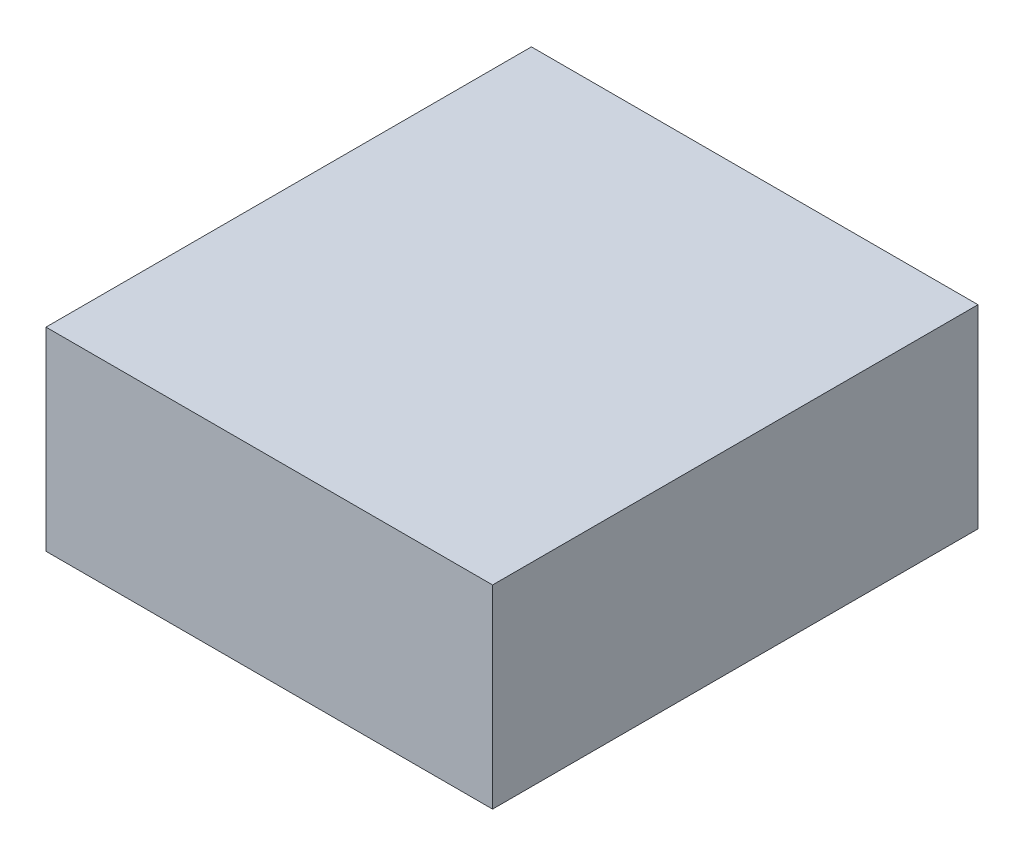
ISO-10303-21;
HEADER;
FILE_DESCRIPTION(('STEP AP214'),'2;1');
FILE_NAME('part.step','',(''),(''),'','','');
FILE_SCHEMA(('AUTOMOTIVE_DESIGN { 1 0 10303 214 1 1 1 1 }'));
ENDSEC;
DATA;
#1=APPLICATION_CONTEXT('core data for automotive mechanical design processes');
#2=APPLICATION_PROTOCOL_DEFINITION('international standard','automotive_design',2000,#1);
#3=PRODUCT_CONTEXT('',#1,'mechanical');
#4=PRODUCT('Part','Part','',(#3));
#5=PRODUCT_RELATED_PRODUCT_CATEGORY('part','',(#4));
#6=PRODUCT_DEFINITION_FORMATION('','',#4);
#7=PRODUCT_DEFINITION_CONTEXT('part definition',#1,'design');
#8=PRODUCT_DEFINITION('design','',#6,#7);
#9=PRODUCT_DEFINITION_SHAPE('','',#8);
#10=(LENGTH_UNIT() NAMED_UNIT(*) SI_UNIT(.MILLI.,.METRE.));
#11=(NAMED_UNIT(*) PLANE_ANGLE_UNIT() SI_UNIT($,.RADIAN.));
#12=(NAMED_UNIT(*) SI_UNIT($,.STERADIAN.) SOLID_ANGLE_UNIT());
#13=UNCERTAINTY_MEASURE_WITH_UNIT(LENGTH_MEASURE(1.E-05),#10,'distance_accuracy_value','');
#14=(GEOMETRIC_REPRESENTATION_CONTEXT(3) GLOBAL_UNCERTAINTY_ASSIGNED_CONTEXT((#13)) GLOBAL_UNIT_ASSIGNED_CONTEXT((#10,
#11,#12)) REPRESENTATION_CONTEXT('',''));
#15=CARTESIAN_POINT('',(0.,0.,0.));
#16=DIRECTION('',(0.,0.,1.));
#17=DIRECTION('',(1.,0.,0.));
#18=AXIS2_PLACEMENT_3D('',#15,#16,#17);
#19=CARTESIAN_POINT('',(0.,20.,0.));
#20=DIRECTION('',(1.,0.,0.));
#21=DIRECTION('',(0.,0.,-1.));
#22=AXIS2_PLACEMENT_3D('',#19,#20,#21);
#23=PLANE('',#22);
#24=DIRECTION('',(0.,0.,1.));
#25=VECTOR('',#24,1.);
#26=CARTESIAN_POINT('',(0.,0.,0.));
#27=LINE('',#26,#25);
#28=CARTESIAN_POINT('',(0.,0.,-50.));
#29=VERTEX_POINT('',#28);
#30=CARTESIAN_POINT('',(0.,0.,0.));
#31=VERTEX_POINT('',#30);
#32=EDGE_CURVE('E99',#29,#31,#27,.T.);
#33=ORIENTED_EDGE('',*,*,#32,.T.);
#34=DIRECTION('',(0.,-1.,0.));
#35=VECTOR('',#34,1.);
#36=CARTESIAN_POINT('',(0.,20.,0.));
#37=LINE('',#36,#35);
#38=CARTESIAN_POINT('',(0.,20.,0.));
#39=VERTEX_POINT('',#38);
#40=EDGE_CURVE('E11',#39,#31,#37,.T.);
#41=ORIENTED_EDGE('',*,*,#40,.F.);
#42=DIRECTION('',(0.,0.,1.));
#43=VECTOR('',#42,1.);
#44=CARTESIAN_POINT('',(0.,20.,0.));
#45=LINE('',#44,#43);
#46=CARTESIAN_POINT('',(0.,20.,-50.));
#47=VERTEX_POINT('',#46);
#48=EDGE_CURVE('E87',#47,#39,#45,.T.);
#49=ORIENTED_EDGE('',*,*,#48,.F.);
#50=DIRECTION('',(0.,-1.,0.));
#51=VECTOR('',#50,1.);
#52=CARTESIAN_POINT('',(0.,20.,-50.));
#53=LINE('',#52,#51);
#54=EDGE_CURVE('E95',#47,#29,#53,.T.);
#55=ORIENTED_EDGE('',*,*,#54,.T.);
#56=EDGE_LOOP('',(#33,#41,#49,#55));
#57=FACE_BOUND('',#56,.T.);
#58=ADVANCED_FACE('F36',(#57),#23,.F.);
#59=CARTESIAN_POINT('',(0.,20.,0.));
#60=DIRECTION('',(0.,0.,-1.));
#61=DIRECTION('',(-1.,0.,0.));
#62=AXIS2_PLACEMENT_3D('',#59,#60,#61);
#63=PLANE('',#62);
#64=DIRECTION('',(1.,0.,0.));
#65=VECTOR('',#64,1.);
#66=CARTESIAN_POINT('',(0.,0.,0.));
#67=LINE('',#66,#65);
#68=CARTESIAN_POINT('',(46.,0.,0.));
#69=VERTEX_POINT('',#68);
#70=EDGE_CURVE('E91',#31,#69,#67,.T.);
#71=ORIENTED_EDGE('',*,*,#70,.T.);
#72=DIRECTION('',(0.,-1.,0.));
#73=VECTOR('',#72,1.);
#74=CARTESIAN_POINT('',(46.,20.,0.));
#75=LINE('',#74,#73);
#76=CARTESIAN_POINT('',(46.,20.,0.));
#77=VERTEX_POINT('',#76);
#78=EDGE_CURVE('E44',#77,#69,#75,.T.);
#79=ORIENTED_EDGE('',*,*,#78,.F.);
#80=DIRECTION('',(1.,0.,0.));
#81=VECTOR('',#80,1.);
#82=CARTESIAN_POINT('',(0.,20.,0.));
#83=LINE('',#82,#81);
#84=EDGE_CURVE('E82',#39,#77,#83,.T.);
#85=ORIENTED_EDGE('',*,*,#84,.F.);
#86=ORIENTED_EDGE('',*,*,#40,.T.);
#87=EDGE_LOOP('',(#71,#79,#85,#86));
#88=FACE_BOUND('',#87,.T.);
#89=ADVANCED_FACE('F90',(#88),#63,.F.);
#90=CARTESIAN_POINT('',(46.,20.,0.));
#91=DIRECTION('',(-1.,0.,0.));
#92=DIRECTION('',(0.,0.,1.));
#93=AXIS2_PLACEMENT_3D('',#90,#91,#92);
#94=PLANE('',#93);
#95=DIRECTION('',(0.,0.,-1.));
#96=VECTOR('',#95,1.);
#97=CARTESIAN_POINT('',(46.,0.,0.));
#98=LINE('',#97,#96);
#99=CARTESIAN_POINT('',(46.,0.,-50.));
#100=VERTEX_POINT('',#99);
#101=EDGE_CURVE('E69',#69,#100,#98,.T.);
#102=ORIENTED_EDGE('',*,*,#101,.T.);
#103=DIRECTION('',(0.,-1.,0.));
#104=VECTOR('',#103,1.);
#105=CARTESIAN_POINT('',(46.,20.,-50.));
#106=LINE('',#105,#104);
#107=CARTESIAN_POINT('',(46.,20.,-50.));
#108=VERTEX_POINT('',#107);
#109=EDGE_CURVE('E92',#108,#100,#106,.T.);
#110=ORIENTED_EDGE('',*,*,#109,.F.);
#111=DIRECTION('',(0.,0.,-1.));
#112=VECTOR('',#111,1.);
#113=CARTESIAN_POINT('',(46.,20.,0.));
#114=LINE('',#113,#112);
#115=EDGE_CURVE('E85',#77,#108,#114,.T.);
#116=ORIENTED_EDGE('',*,*,#115,.F.);
#117=ORIENTED_EDGE('',*,*,#78,.T.);
#118=EDGE_LOOP('',(#102,#110,#116,#117));
#119=FACE_BOUND('',#118,.T.);
#120=ADVANCED_FACE('F93',(#119),#94,.F.);
#121=CARTESIAN_POINT('',(0.,20.,-50.));
#122=DIRECTION('',(0.,0.,1.));
#123=DIRECTION('',(1.,0.,0.));
#124=AXIS2_PLACEMENT_3D('',#121,#122,#123);
#125=PLANE('',#124);
#126=DIRECTION('',(-1.,0.,0.));
#127=VECTOR('',#126,1.);
#128=CARTESIAN_POINT('',(0.,0.,-50.));
#129=LINE('',#128,#127);
#130=EDGE_CURVE('E75',#100,#29,#129,.T.);
#131=ORIENTED_EDGE('',*,*,#130,.T.);
#132=ORIENTED_EDGE('',*,*,#54,.F.);
#133=DIRECTION('',(-1.,0.,0.));
#134=VECTOR('',#133,1.);
#135=CARTESIAN_POINT('',(0.,20.,-50.));
#136=LINE('',#135,#134);
#137=EDGE_CURVE('E52',#108,#47,#136,.T.);
#138=ORIENTED_EDGE('',*,*,#137,.F.);
#139=ORIENTED_EDGE('',*,*,#109,.T.);
#140=EDGE_LOOP('',(#131,#132,#138,#139));
#141=FACE_BOUND('',#140,.T.);
#142=ADVANCED_FACE('F106',(#141),#125,.F.);
#143=CARTESIAN_POINT('',(0.,20.,0.));
#144=DIRECTION('',(0.,-1.,0.));
#145=DIRECTION('',(0.,0.,-1.));
#146=AXIS2_PLACEMENT_3D('',#143,#144,#145);
#147=PLANE('',#146);
#148=ORIENTED_EDGE('',*,*,#48,.T.);
#149=ORIENTED_EDGE('',*,*,#84,.T.);
#150=ORIENTED_EDGE('',*,*,#115,.T.);
#151=ORIENTED_EDGE('',*,*,#137,.T.);
#152=EDGE_LOOP('',(#148,#149,#150,#151));
#153=FACE_BOUND('',#152,.T.);
#154=ADVANCED_FACE('F83',(#153),#147,.F.);
#155=CARTESIAN_POINT('',(0.,0.,0.));
#156=DIRECTION('',(0.,-1.,0.));
#157=DIRECTION('',(0.,0.,-1.));
#158=AXIS2_PLACEMENT_3D('',#155,#156,#157);
#159=PLANE('',#158);
#160=ORIENTED_EDGE('',*,*,#32,.F.);
#161=ORIENTED_EDGE('',*,*,#130,.F.);
#162=ORIENTED_EDGE('',*,*,#101,.F.);
#163=ORIENTED_EDGE('',*,*,#70,.F.);
#164=EDGE_LOOP('',(#160,#161,#162,#163));
#165=FACE_BOUND('',#164,.T.);
#166=ADVANCED_FACE('F109',(#165),#159,.T.);
#167=CLOSED_SHELL('',(#58,#89,#120,#142,#154,#166));
#168=MANIFOLD_SOLID_BREP('B2',#167);
#169=ADVANCED_BREP_SHAPE_REPRESENTATION('',(#18,#168),#14);
#170=SHAPE_DEFINITION_REPRESENTATION(#9,#169);
ENDSEC;
END-ISO-10303-21;
